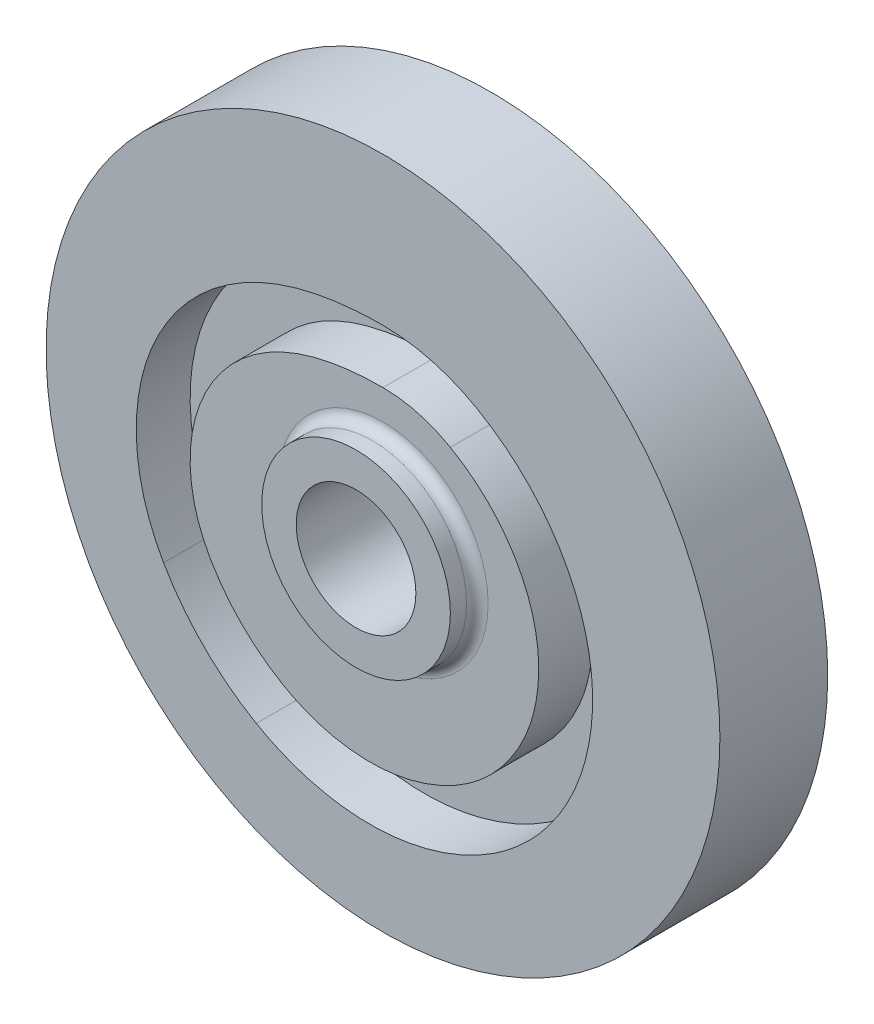
ISO-10303-21;
HEADER;
FILE_DESCRIPTION(('STEP AP214'),'2;1');
FILE_NAME('part.step','',(''),(''),'','','');
FILE_SCHEMA(('AUTOMOTIVE_DESIGN { 1 0 10303 214 1 1 1 1 }'));
ENDSEC;
DATA;
#1=APPLICATION_CONTEXT('core data for automotive mechanical design processes');
#2=APPLICATION_PROTOCOL_DEFINITION('international standard','automotive_design',2000,#1);
#3=PRODUCT_CONTEXT('',#1,'mechanical');
#4=PRODUCT('Part','Part','',(#3));
#5=PRODUCT_RELATED_PRODUCT_CATEGORY('part','',(#4));
#6=PRODUCT_DEFINITION_FORMATION('','',#4);
#7=PRODUCT_DEFINITION_CONTEXT('part definition',#1,'design');
#8=PRODUCT_DEFINITION('design','',#6,#7);
#9=PRODUCT_DEFINITION_SHAPE('','',#8);
#10=(LENGTH_UNIT() NAMED_UNIT(*) SI_UNIT(.MILLI.,.METRE.));
#11=(NAMED_UNIT(*) PLANE_ANGLE_UNIT() SI_UNIT($,.RADIAN.));
#12=(NAMED_UNIT(*) SI_UNIT($,.STERADIAN.) SOLID_ANGLE_UNIT());
#13=UNCERTAINTY_MEASURE_WITH_UNIT(LENGTH_MEASURE(1.E-05),#10,'distance_accuracy_value','');
#14=(GEOMETRIC_REPRESENTATION_CONTEXT(3) GLOBAL_UNCERTAINTY_ASSIGNED_CONTEXT((#13)) GLOBAL_UNIT_ASSIGNED_CONTEXT((#10,
#11,#12)) REPRESENTATION_CONTEXT('',''));
#15=CARTESIAN_POINT('',(0.,0.,0.));
#16=DIRECTION('',(0.,0.,1.));
#17=DIRECTION('',(1.,0.,0.));
#18=AXIS2_PLACEMENT_3D('',#15,#16,#17);
#19=CARTESIAN_POINT('',(0.,-137.641421356237,20.));
#20=DIRECTION('',(0.,0.,1.));
#21=DIRECTION('',(1.,0.,0.));
#22=AXIS2_PLACEMENT_3D('',#19,#20,#21);
#23=PLANE('',#22);
#24=CARTESIAN_POINT('',(0.,0.,20.));
#25=DIRECTION('',(0.,0.,1.));
#26=DIRECTION('',(1.,0.,0.));
#27=AXIS2_PLACEMENT_3D('',#24,#25,#26);
#28=CIRCLE('',#27,62.5);
#29=CARTESIAN_POINT('',(62.5,0.,20.));
#30=VERTEX_POINT('',#29);
#31=EDGE_CURVE('E176',#30,#30,#28,.T.);
#32=ORIENTED_EDGE('',*,*,#31,.T.);
#33=EDGE_LOOP('',(#32));
#34=FACE_BOUND('',#33,.T.);
#35=CARTESIAN_POINT('',(0.,0.,20.));
#36=DIRECTION('',(0.,0.,1.));
#37=DIRECTION('',(1.,0.,0.));
#38=AXIS2_PLACEMENT_3D('',#35,#36,#37);
#39=CIRCLE('',#38,47.);
#40=CARTESIAN_POINT('',(-40.7031939778687,-23.4999999999999,20.));
#41=VERTEX_POINT('',#40);
#42=CARTESIAN_POINT('',(-23.5000000000001,-40.7031939778686,20.));
#43=VERTEX_POINT('',#42);
#44=EDGE_CURVE('E253',#41,#43,#39,.T.);
#45=ORIENTED_EDGE('',*,*,#44,.F.);
#46=CARTESIAN_POINT('',(-40.7031939778687,-23.4999999999999,20.));
#47=CARTESIAN_POINT('',(-41.6334685377336,-21.8887171973251,20.));
#48=CARTESIAN_POINT('',(-43.261081237922,-18.5156221688604,20.));
#49=CARTESIAN_POINT('',(-45.476023039889,-11.4367358366006,20.));
#50=CARTESIAN_POINT('',(-46.2436917445193,-2.10796851513634,20.));
#51=CARTESIAN_POINT('',(-43.902529686518,8.89750578097264,20.));
#52=CARTESIAN_POINT('',(-38.4635483380285,18.7287409637537,20.));
#53=CARTESIAN_POINT('',(-30.4813637366321,26.5585801273208,20.));
#54=CARTESIAN_POINT('',(-20.7611846193058,31.8417853986932,20.));
#55=CARTESIAN_POINT('',(-12.0984465664999,34.0777292610294,20.));
#56=CARTESIAN_POINT('',(-5.16306320945163,34.8818694367635,20.));
#57=CARTESIAN_POINT('',(-1.7246101036514,35.,20.));
#58=CARTESIAN_POINT('',(0.,35.,20.));
#59=B_SPLINE_CURVE_WITH_KNOTS('',3,(#46,#47,#48,#49,#50,#51,#52,#53,#54,#55,#56,#57,#58),
.UNSPECIFIED.,.F.,.F.,(4,1,1,1,1,1,1,1,1,1,4),(0.,0.0625,0.125,0.25,0.375,0.5,0.625,0.75,0.875,
0.9375,1.),.UNSPECIFIED.);
#60=CARTESIAN_POINT('',(0.,35.,20.));
#61=VERTEX_POINT('',#60);
#62=EDGE_CURVE('E47',#41,#61,#59,.T.);
#63=ORIENTED_EDGE('',*,*,#62,.T.);
#64=CARTESIAN_POINT('',(0.,0.,20.));
#65=DIRECTION('',(0.,0.,1.));
#66=DIRECTION('',(1.,0.,0.));
#67=AXIS2_PLACEMENT_3D('',#64,#65,#66);
#68=CIRCLE('',#67,35.);
#69=CARTESIAN_POINT('',(17.5,30.3108891324553,20.));
#70=VERTEX_POINT('',#69);
#71=EDGE_CURVE('E211',#70,#61,#68,.T.);
#72=ORIENTED_EDGE('',*,*,#71,.F.);
#73=CARTESIAN_POINT('',(17.5,30.3108891324553,20.));
#74=CARTESIAN_POINT('',(19.8230717520997,28.9696630310338,20.));
#75=CARTESIAN_POINT('',(24.2422415992508,25.860788383586,20.));
#76=CARTESIAN_POINT('',(31.7674865380313,18.1593049307756,20.));
#77=CARTESIAN_POINT('',(36.9579364853341,8.44241985817381,20.));
#78=CARTESIAN_POINT('',(39.023468485504,-2.34751043143316,20.));
#79=CARTESIAN_POINT('',(38.872672017683,-10.5601551035796,20.));
#80=CARTESIAN_POINT('',(37.094152941544,-18.593345142246,20.));
#81=CARTESIAN_POINT('',(33.6798153813832,-26.1069507980113,20.));
#82=CARTESIAN_POINT('',(28.8613515569635,-32.7441294214389,20.));
#83=CARTESIAN_POINT('',(20.7772547056511,-40.190094392665,20.));
#84=CARTESIAN_POINT('',(10.741659927478,-44.9035382661179,20.));
#85=CARTESIAN_POINT('',(-0.034110412058589,-46.5845639735566,20.));
#86=CARTESIAN_POINT('',(-8.18513011874363,-46.2416151609811,20.));
#87=CARTESIAN_POINT('',(-14.7976649186366,-44.6613903169365,20.));
#88=CARTESIAN_POINT('',(-19.8640084967852,-42.6478933976114,20.));
#89=CARTESIAN_POINT('',(-22.3127518048334,-41.388652042943,20.));
#90=CARTESIAN_POINT('',(-23.5,-40.7031939778686,20.));
#91=B_SPLINE_CURVE_WITH_KNOTS('',3,(#73,#74,#75,#76,#77,#78,#79,#80,#81,#82,#83,#84,#85,#86,#87,
#88,#89,#90),.UNSPECIFIED.,.F.,.F.,(4,1,1,1,1,1,1,1,1,1,1,1,1,1,1,4),(0.,0.0625,0.125,0.25,
0.3125,0.375,0.4375,0.5,0.5625,0.625,0.75,0.8125,0.875,0.9375,0.96875,1.),.UNSPECIFIED.);
#92=EDGE_CURVE('E251',#70,#43,#91,.T.);
#93=ORIENTED_EDGE('',*,*,#92,.T.);
#94=EDGE_LOOP('',(#45,#63,#72,#93));
#95=FACE_BOUND('',#94,.T.);
#96=ADVANCED_FACE('F32',(#34,#95),#23,.T.);
#97=CARTESIAN_POINT('',(0.,0.,20.));
#98=DIRECTION('',(0.,0.,1.));
#99=DIRECTION('',(1.,0.,0.));
#100=AXIS2_PLACEMENT_3D('',#97,#98,#99);
#101=CIRCLE('',#100,19.5);
#102=CARTESIAN_POINT('',(19.5,0.,20.));
#103=VERTEX_POINT('',#102);
#104=EDGE_CURVE('E11',#103,#103,#101,.F.);
#105=ORIENTED_EDGE('',*,*,#104,.T.);
#106=EDGE_LOOP('',(#105));
#107=FACE_BOUND('',#106,.T.);
#108=CARTESIAN_POINT('',(-32.0429399400243,-18.4999999999999,20.));
#109=CARTESIAN_POINT('',(-32.7281649671322,-17.3131554384313,20.));
#110=CARTESIAN_POINT('',(-33.9271147643805,-14.8284070434259,20.));
#111=CARTESIAN_POINT('',(-35.5580156671567,-9.61524406204795,20.));
#112=CARTESIAN_POINT('',(-36.1196082053352,-2.76657539813786,20.));
#113=CARTESIAN_POINT('',(-34.4003220611957,5.3486246331334,20.));
#114=CARTESIAN_POINT('',(-30.3881378010402,12.5918208161777,20.));
#115=CARTESIAN_POINT('',(-25.4695178555637,17.4230052658745,20.));
#116=CARTESIAN_POINT('',(-20.7941116056334,20.416968224699,20.));
#117=CARTESIAN_POINT('',(-15.7676717888697,22.7680180136662,20.));
#118=CARTESIAN_POINT('',(-10.2067997274994,24.2256606889948,20.));
#119=CARTESIAN_POINT('',(-4.44225215696656,24.8972818730671,20.));
#120=CARTESIAN_POINT('',(-1.47461378529173,25.,20.));
#121=CARTESIAN_POINT('',(0.,25.,20.));
#122=B_SPLINE_CURVE_WITH_KNOTS('',3,(#108,#109,#110,#111,#112,#113,#114,#115,#116,#117,#118,
#119,#120,#121),.UNSPECIFIED.,.F.,.F.,(4,1,1,1,1,1,1,1,1,1,1,4),(0.,0.0625,0.125,0.25,0.375,0.5,
0.625,0.6875,0.75,0.875,0.9375,1.),.UNSPECIFIED.);
#123=CARTESIAN_POINT('',(-32.0429399400243,-18.4999999999999,20.));
#124=VERTEX_POINT('',#123);
#125=CARTESIAN_POINT('',(0.,25.,20.));
#126=VERTEX_POINT('',#125);
#127=EDGE_CURVE('E203',#124,#126,#122,.T.);
#128=ORIENTED_EDGE('',*,*,#127,.F.);
#129=CARTESIAN_POINT('',(0.,0.,20.));
#130=DIRECTION('',(0.,0.,1.));
#131=DIRECTION('',(1.,0.,0.));
#132=AXIS2_PLACEMENT_3D('',#129,#130,#131);
#133=CIRCLE('',#132,37.);
#134=CARTESIAN_POINT('',(-18.5,-32.0429399400242,20.));
#135=VERTEX_POINT('',#134);
#136=EDGE_CURVE('E55',#124,#135,#133,.T.);
#137=ORIENTED_EDGE('',*,*,#136,.T.);
#138=CARTESIAN_POINT('',(12.5,21.6506350946109,20.));
#139=CARTESIAN_POINT('',(14.3000505103376,20.6113754479126,20.));
#140=CARTESIAN_POINT('',(17.7365460360028,18.1922821101831,20.));
#141=CARTESIAN_POINT('',(22.0573597497303,13.7662514392354,20.));
#142=CARTESIAN_POINT('',(25.469897132591,8.58906907609287,20.));
#143=CARTESIAN_POINT('',(27.8348958032989,2.83718394254132,20.));
#144=CARTESIAN_POINT('',(28.9862336190251,-3.18490434412384,20.));
#145=CARTESIAN_POINT('',(28.8760558731626,-9.37788778346869,20.));
#146=CARTESIAN_POINT('',(27.5357423087247,-15.4159216475564,20.));
#147=CARTESIAN_POINT('',(24.9902354469051,-21.0217686716921,20.));
#148=CARTESIAN_POINT('',(21.332338770824,-26.0626304877978,20.));
#149=CARTESIAN_POINT('',(16.7758197266253,-30.2594309287163,20.));
#150=CARTESIAN_POINT('',(11.4508193011023,-33.4507053078713,20.));
#151=CARTESIAN_POINT('',(5.55023306841124,-35.5776606117184,20.));
#152=CARTESIAN_POINT('',(-0.603962423950596,-36.5366479897178,20.));
#153=CARTESIAN_POINT('',(-6.79210587388754,-36.274910535155,20.));
#154=CARTESIAN_POINT('',(-12.8485401761874,-34.833293241595,20.));
#155=CARTESIAN_POINT('',(-16.6921895329683,-33.0866797998088,20.));
#156=CARTESIAN_POINT('',(-18.5,-32.0429399400242,20.));
#157=B_SPLINE_CURVE_WITH_KNOTS('',3,(#138,#139,#140,#141,#142,#143,#144,#145,#146,#147,#148,
#149,#150,#151,#152,#153,#154,#155,#156),.UNSPECIFIED.,.F.,.F.,(4,1,1,1,1,1,1,1,1,1,1,1,1,1,1,1,
4),(0.,0.0625,0.125,0.1875,0.25,0.3125,0.375,0.4375,0.5,0.5625,0.625,0.6875,0.75,0.8125,0.875,
0.9375,1.),.UNSPECIFIED.);
#158=CARTESIAN_POINT('',(12.5,21.6506350946109,20.));
#159=VERTEX_POINT('',#158);
#160=EDGE_CURVE('E115',#159,#135,#157,.T.);
#161=ORIENTED_EDGE('',*,*,#160,.F.);
#162=CARTESIAN_POINT('',(0.,0.,20.));
#163=DIRECTION('',(0.,0.,1.));
#164=DIRECTION('',(1.,0.,0.));
#165=AXIS2_PLACEMENT_3D('',#162,#163,#164);
#166=CIRCLE('',#165,25.);
#167=EDGE_CURVE('E206',#159,#126,#166,.T.);
#168=ORIENTED_EDGE('',*,*,#167,.T.);
#169=EDGE_LOOP('',(#128,#137,#161,#168));
#170=FACE_BOUND('',#169,.T.);
#171=ADVANCED_FACE('F162',(#107,#170),#23,.T.);
#172=CARTESIAN_POINT('',(0.,0.,20.));
#173=DIRECTION('',(0.,0.,-1.));
#174=DIRECTION('',(-1.,0.,0.));
#175=AXIS2_PLACEMENT_3D('',#172,#173,#174);
#176=CYLINDRICAL_SURFACE('',#175,62.5);
#177=ORIENTED_EDGE('',*,*,#31,.F.);
#178=EDGE_LOOP('',(#177));
#179=FACE_BOUND('',#178,.T.);
#180=CARTESIAN_POINT('',(0.,0.,0.));
#181=DIRECTION('',(0.,0.,1.));
#182=DIRECTION('',(1.,0.,0.));
#183=AXIS2_PLACEMENT_3D('',#180,#181,#182);
#184=CIRCLE('',#183,62.5);
#185=CARTESIAN_POINT('',(62.5,0.,0.));
#186=VERTEX_POINT('',#185);
#187=EDGE_CURVE('E179',#186,#186,#184,.T.);
#188=ORIENTED_EDGE('',*,*,#187,.T.);
#189=EDGE_LOOP('',(#188));
#190=FACE_BOUND('',#189,.T.);
#191=ADVANCED_FACE('F165',(#179,#190),#176,.T.);
#192=CARTESIAN_POINT('',(0.,-137.641421356237,0.));
#193=DIRECTION('',(0.,0.,1.));
#194=DIRECTION('',(1.,0.,0.));
#195=AXIS2_PLACEMENT_3D('',#192,#193,#194);
#196=PLANE('',#195);
#197=ORIENTED_EDGE('',*,*,#187,.F.);
#198=EDGE_LOOP('',(#197));
#199=FACE_BOUND('',#198,.T.);
#200=CARTESIAN_POINT('',(0.,0.,0.));
#201=DIRECTION('',(0.,0.,1.));
#202=DIRECTION('',(1.,0.,0.));
#203=AXIS2_PLACEMENT_3D('',#200,#201,#202);
#204=CIRCLE('',#203,11.1);
#205=CARTESIAN_POINT('',(11.1,0.,0.));
#206=VERTEX_POINT('',#205);
#207=EDGE_CURVE('E229',#206,#206,#204,.T.);
#208=ORIENTED_EDGE('',*,*,#207,.T.);
#209=EDGE_LOOP('',(#208));
#210=FACE_BOUND('',#209,.T.);
#211=ADVANCED_FACE('F158',(#199,#210),#196,.F.);
#212=CARTESIAN_POINT('',(0.,0.,25.));
#213=DIRECTION('',(0.,0.,-1.));
#214=DIRECTION('',(-1.,0.,0.));
#215=AXIS2_PLACEMENT_3D('',#212,#213,#214);
#216=CYLINDRICAL_SURFACE('',#215,11.1);
#217=CARTESIAN_POINT('',(0.,0.,25.));
#218=DIRECTION('',(0.,0.,1.));
#219=DIRECTION('',(1.,0.,0.));
#220=AXIS2_PLACEMENT_3D('',#217,#218,#219);
#221=CIRCLE('',#220,11.1);
#222=CARTESIAN_POINT('',(11.1,0.,25.));
#223=VERTEX_POINT('',#222);
#224=EDGE_CURVE('E184',#223,#223,#221,.T.);
#225=ORIENTED_EDGE('',*,*,#224,.T.);
#226=EDGE_LOOP('',(#225));
#227=FACE_BOUND('',#226,.T.);
#228=ORIENTED_EDGE('',*,*,#207,.F.);
#229=EDGE_LOOP('',(#228));
#230=FACE_BOUND('',#229,.T.);
#231=ADVANCED_FACE('F154',(#227,#230),#216,.F.);
#232=CARTESIAN_POINT('',(0.,0.,25.));
#233=DIRECTION('',(0.,0.,-1.));
#234=DIRECTION('',(-1.,0.,0.));
#235=AXIS2_PLACEMENT_3D('',#232,#233,#234);
#236=CYLINDRICAL_SURFACE('',#235,17.5);
#237=CARTESIAN_POINT('',(0.,0.,22.));
#238=DIRECTION('',(0.,0.,1.));
#239=DIRECTION('',(1.,0.,0.));
#240=AXIS2_PLACEMENT_3D('',#237,#238,#239);
#241=CIRCLE('',#240,17.5);
#242=CARTESIAN_POINT('',(17.5,0.,22.));
#243=VERTEX_POINT('',#242);
#244=EDGE_CURVE('E40',#243,#243,#241,.T.);
#245=ORIENTED_EDGE('',*,*,#244,.T.);
#246=EDGE_LOOP('',(#245));
#247=FACE_BOUND('',#246,.T.);
#248=CARTESIAN_POINT('',(0.,0.,25.));
#249=DIRECTION('',(0.,0.,1.));
#250=DIRECTION('',(1.,0.,0.));
#251=AXIS2_PLACEMENT_3D('',#248,#249,#250);
#252=CIRCLE('',#251,17.5);
#253=CARTESIAN_POINT('',(17.5,0.,25.));
#254=VERTEX_POINT('',#253);
#255=EDGE_CURVE('E180',#254,#254,#252,.T.);
#256=ORIENTED_EDGE('',*,*,#255,.F.);
#257=EDGE_LOOP('',(#256));
#258=FACE_BOUND('',#257,.T.);
#259=ADVANCED_FACE('F150',(#247,#258),#236,.T.);
#260=CARTESIAN_POINT('',(0.,-137.641421356237,25.));
#261=DIRECTION('',(0.,0.,1.));
#262=DIRECTION('',(1.,0.,0.));
#263=AXIS2_PLACEMENT_3D('',#260,#261,#262);
#264=PLANE('',#263);
#265=ORIENTED_EDGE('',*,*,#224,.F.);
#266=EDGE_LOOP('',(#265));
#267=FACE_BOUND('',#266,.T.);
#268=ORIENTED_EDGE('',*,*,#255,.T.);
#269=EDGE_LOOP('',(#268));
#270=FACE_BOUND('',#269,.T.);
#271=ADVANCED_FACE('F147',(#267,#270),#264,.T.);
#272=CARTESIAN_POINT('',(0.,0.,22.));
#273=DIRECTION('',(0.,0.,1.));
#274=DIRECTION('',(1.,0.,0.));
#275=AXIS2_PLACEMENT_3D('',#272,#273,#274);
#276=TOROIDAL_SURFACE('',#275,19.5,2.);
#277=ORIENTED_EDGE('',*,*,#104,.F.);
#278=EDGE_LOOP('',(#277));
#279=FACE_BOUND('',#278,.T.);
#280=ORIENTED_EDGE('',*,*,#244,.F.);
#281=EDGE_LOOP('',(#280));
#282=FACE_BOUND('',#281,.T.);
#283=ADVANCED_FACE('F34',(#279,#282),#276,.F.);
#284=CARTESIAN_POINT('',(0.,0.,10.));
#285=DIRECTION('',(0.,0.,1.));
#286=DIRECTION('',(1.,0.,0.));
#287=AXIS2_PLACEMENT_3D('',#284,#285,#286);
#288=CYLINDRICAL_SURFACE('',#287,37.);
#289=ORIENTED_EDGE('',*,*,#136,.F.);
#290=DIRECTION('',(0.,0.,1.));
#291=VECTOR('',#290,1.);
#292=CARTESIAN_POINT('',(-32.0429399400243,-18.4999999999999,10.));
#293=LINE('',#292,#291);
#294=CARTESIAN_POINT('',(-32.0429399400243,-18.4999999999999,10.));
#295=VERTEX_POINT('',#294);
#296=EDGE_CURVE('E234',#295,#124,#293,.T.);
#297=ORIENTED_EDGE('',*,*,#296,.F.);
#298=CARTESIAN_POINT('',(0.,0.,10.));
#299=DIRECTION('',(0.,0.,1.));
#300=DIRECTION('',(1.,0.,0.));
#301=AXIS2_PLACEMENT_3D('',#298,#299,#300);
#302=CIRCLE('',#301,37.);
#303=CARTESIAN_POINT('',(-18.5,-32.0429399400242,10.));
#304=VERTEX_POINT('',#303);
#305=EDGE_CURVE('E294',#295,#304,#302,.T.);
#306=ORIENTED_EDGE('',*,*,#305,.T.);
#307=DIRECTION('',(0.,0.,1.));
#308=VECTOR('',#307,1.);
#309=CARTESIAN_POINT('',(-18.5,-32.0429399400242,10.));
#310=LINE('',#309,#308);
#311=EDGE_CURVE('E224',#304,#135,#310,.T.);
#312=ORIENTED_EDGE('',*,*,#311,.T.);
#313=EDGE_LOOP('',(#289,#297,#306,#312));
#314=FACE_BOUND('',#313,.T.);
#315=ADVANCED_FACE('F192',(#314),#288,.T.);
#316=CARTESIAN_POINT('',(12.5,21.6506350946109,10.));
#317=CARTESIAN_POINT('',(14.3000505103376,20.6113754479126,10.));
#318=CARTESIAN_POINT('',(17.7365460360028,18.1922821101831,10.));
#319=CARTESIAN_POINT('',(22.0573597497303,13.7662514392354,10.));
#320=CARTESIAN_POINT('',(25.469897132591,8.58906907609287,10.));
#321=CARTESIAN_POINT('',(27.8348958032989,2.83718394254132,10.));
#322=CARTESIAN_POINT('',(28.9862336190251,-3.18490434412384,10.));
#323=CARTESIAN_POINT('',(28.8760558731626,-9.37788778346869,10.));
#324=CARTESIAN_POINT('',(27.5357423087247,-15.4159216475564,10.));
#325=CARTESIAN_POINT('',(24.9902354469051,-21.0217686716921,10.));
#326=CARTESIAN_POINT('',(21.332338770824,-26.0626304877978,10.));
#327=CARTESIAN_POINT('',(16.7758197266253,-30.2594309287163,10.));
#328=CARTESIAN_POINT('',(11.4508193011023,-33.4507053078713,10.));
#329=CARTESIAN_POINT('',(5.55023306841124,-35.5776606117184,10.));
#330=CARTESIAN_POINT('',(-0.603962423950596,-36.5366479897178,10.));
#331=CARTESIAN_POINT('',(-6.79210587388754,-36.274910535155,10.));
#332=CARTESIAN_POINT('',(-12.8485401761874,-34.833293241595,10.));
#333=CARTESIAN_POINT('',(-16.6921895329683,-33.0866797998088,10.));
#334=CARTESIAN_POINT('',(-18.5,-32.0429399400242,10.));
#335=B_SPLINE_CURVE_WITH_KNOTS('',3,(#316,#317,#318,#319,#320,#321,#322,#323,#324,#325,#326,
#327,#328,#329,#330,#331,#332,#333,#334),.UNSPECIFIED.,.F.,.F.,(4,1,1,1,1,1,1,1,1,1,1,1,1,1,1,1,
4),(0.,0.0625,0.125,0.1875,0.25,0.3125,0.375,0.4375,0.5,0.5625,0.625,0.6875,0.75,0.8125,0.875,
0.9375,1.),.UNSPECIFIED.);
#336=DIRECTION('',(0.,0.,1.));
#337=VECTOR('',#336,1.);
#338=SURFACE_OF_LINEAR_EXTRUSION('',#335,#337);
#339=ORIENTED_EDGE('',*,*,#160,.T.);
#340=ORIENTED_EDGE('',*,*,#311,.F.);
#341=CARTESIAN_POINT('',(12.5,21.6506350946109,10.));
#342=VERTEX_POINT('',#341);
#343=EDGE_CURVE('E104',#342,#304,#335,.T.);
#344=ORIENTED_EDGE('',*,*,#343,.F.);
#345=DIRECTION('',(0.,0.,1.));
#346=VECTOR('',#345,1.);
#347=CARTESIAN_POINT('',(12.5,21.6506350946109,10.));
#348=LINE('',#347,#346);
#349=EDGE_CURVE('E230',#342,#159,#348,.T.);
#350=ORIENTED_EDGE('',*,*,#349,.T.);
#351=EDGE_LOOP('',(#339,#340,#344,#350));
#352=FACE_BOUND('',#351,.T.);
#353=ADVANCED_FACE('F197',(#352),#338,.F.);
#354=CARTESIAN_POINT('',(0.,0.,10.));
#355=DIRECTION('',(0.,0.,1.));
#356=DIRECTION('',(1.,0.,0.));
#357=AXIS2_PLACEMENT_3D('',#354,#355,#356);
#358=CYLINDRICAL_SURFACE('',#357,25.);
#359=ORIENTED_EDGE('',*,*,#167,.F.);
#360=ORIENTED_EDGE('',*,*,#349,.F.);
#361=CARTESIAN_POINT('',(0.,0.,10.));
#362=DIRECTION('',(0.,0.,1.));
#363=DIRECTION('',(1.,0.,0.));
#364=AXIS2_PLACEMENT_3D('',#361,#362,#363);
#365=CIRCLE('',#364,25.);
#366=CARTESIAN_POINT('',(0.,25.,10.));
#367=VERTEX_POINT('',#366);
#368=EDGE_CURVE('E275',#342,#367,#365,.T.);
#369=ORIENTED_EDGE('',*,*,#368,.T.);
#370=DIRECTION('',(0.,0.,1.));
#371=VECTOR('',#370,1.);
#372=CARTESIAN_POINT('',(0.,25.,10.));
#373=LINE('',#372,#371);
#374=EDGE_CURVE('E232',#367,#126,#373,.T.);
#375=ORIENTED_EDGE('',*,*,#374,.T.);
#376=EDGE_LOOP('',(#359,#360,#369,#375));
#377=FACE_BOUND('',#376,.T.);
#378=ADVANCED_FACE('F146',(#377),#358,.T.);
#379=CARTESIAN_POINT('',(-40.7031939778687,-23.4999999999999,10.));
#380=CARTESIAN_POINT('',(-41.6334685377336,-21.8887171973251,10.));
#381=CARTESIAN_POINT('',(-43.261081237922,-18.5156221688604,10.));
#382=CARTESIAN_POINT('',(-45.476023039889,-11.4367358366006,10.));
#383=CARTESIAN_POINT('',(-46.2436917445193,-2.10796851513634,10.));
#384=CARTESIAN_POINT('',(-43.902529686518,8.89750578097264,10.));
#385=CARTESIAN_POINT('',(-38.4635483380285,18.7287409637537,10.));
#386=CARTESIAN_POINT('',(-30.4813637366321,26.5585801273208,10.));
#387=CARTESIAN_POINT('',(-20.7611846193058,31.8417853986932,10.));
#388=CARTESIAN_POINT('',(-12.0984465664999,34.0777292610294,10.));
#389=CARTESIAN_POINT('',(-5.16306320945163,34.8818694367635,10.));
#390=CARTESIAN_POINT('',(-1.7246101036514,35.,10.));
#391=CARTESIAN_POINT('',(0.,35.,10.));
#392=B_SPLINE_CURVE_WITH_KNOTS('',3,(#379,#380,#381,#382,#383,#384,#385,#386,#387,#388,#389,
#390,#391),.UNSPECIFIED.,.F.,.F.,(4,1,1,1,1,1,1,1,1,1,4),(0.,0.0625,0.125,0.25,0.375,0.5,0.625,
0.75,0.875,0.9375,1.),.UNSPECIFIED.);
#393=DIRECTION('',(0.,0.,1.));
#394=VECTOR('',#393,1.);
#395=SURFACE_OF_LINEAR_EXTRUSION('',#392,#394);
#396=ORIENTED_EDGE('',*,*,#62,.F.);
#397=DIRECTION('',(0.,0.,1.));
#398=VECTOR('',#397,1.);
#399=CARTESIAN_POINT('',(-40.7031939778687,-23.4999999999999,10.));
#400=LINE('',#399,#398);
#401=CARTESIAN_POINT('',(-40.7031939778687,-23.4999999999999,10.));
#402=VERTEX_POINT('',#401);
#403=EDGE_CURVE('E94',#402,#41,#400,.T.);
#404=ORIENTED_EDGE('',*,*,#403,.F.);
#405=CARTESIAN_POINT('',(0.,35.,10.));
#406=VERTEX_POINT('',#405);
#407=EDGE_CURVE('E97',#402,#406,#392,.T.);
#408=ORIENTED_EDGE('',*,*,#407,.T.);
#409=DIRECTION('',(0.,0.,1.));
#410=VECTOR('',#409,1.);
#411=CARTESIAN_POINT('',(0.,35.,10.));
#412=LINE('',#411,#410);
#413=EDGE_CURVE('E236',#406,#61,#412,.T.);
#414=ORIENTED_EDGE('',*,*,#413,.T.);
#415=EDGE_LOOP('',(#396,#404,#408,#414));
#416=FACE_BOUND('',#415,.T.);
#417=ADVANCED_FACE('F96',(#416),#395,.T.);
#418=CARTESIAN_POINT('',(0.,0.,10.));
#419=DIRECTION('',(0.,0.,1.));
#420=DIRECTION('',(1.,0.,0.));
#421=AXIS2_PLACEMENT_3D('',#418,#419,#420);
#422=CYLINDRICAL_SURFACE('',#421,35.);
#423=ORIENTED_EDGE('',*,*,#71,.T.);
#424=ORIENTED_EDGE('',*,*,#413,.F.);
#425=CARTESIAN_POINT('',(0.,0.,10.));
#426=DIRECTION('',(0.,0.,1.));
#427=DIRECTION('',(1.,0.,0.));
#428=AXIS2_PLACEMENT_3D('',#425,#426,#427);
#429=CIRCLE('',#428,35.);
#430=CARTESIAN_POINT('',(17.5,30.3108891324553,10.));
#431=VERTEX_POINT('',#430);
#432=EDGE_CURVE('E114',#431,#406,#429,.T.);
#433=ORIENTED_EDGE('',*,*,#432,.F.);
#434=DIRECTION('',(0.,0.,1.));
#435=VECTOR('',#434,1.);
#436=CARTESIAN_POINT('',(17.5,30.3108891324553,10.));
#437=LINE('',#436,#435);
#438=EDGE_CURVE('E238',#431,#70,#437,.T.);
#439=ORIENTED_EDGE('',*,*,#438,.T.);
#440=EDGE_LOOP('',(#423,#424,#433,#439));
#441=FACE_BOUND('',#440,.T.);
#442=ADVANCED_FACE('F138',(#441),#422,.F.);
#443=CARTESIAN_POINT('',(17.5,30.3108891324553,10.));
#444=CARTESIAN_POINT('',(19.8230717520997,28.9696630310338,10.));
#445=CARTESIAN_POINT('',(24.2422415992508,25.860788383586,10.));
#446=CARTESIAN_POINT('',(31.7674865380313,18.1593049307756,10.));
#447=CARTESIAN_POINT('',(36.9579364853341,8.44241985817381,10.));
#448=CARTESIAN_POINT('',(39.023468485504,-2.34751043143316,10.));
#449=CARTESIAN_POINT('',(38.872672017683,-10.5601551035796,10.));
#450=CARTESIAN_POINT('',(37.094152941544,-18.593345142246,10.));
#451=CARTESIAN_POINT('',(33.6798153813832,-26.1069507980113,10.));
#452=CARTESIAN_POINT('',(28.8613515569635,-32.7441294214389,10.));
#453=CARTESIAN_POINT('',(20.7772547056511,-40.190094392665,10.));
#454=CARTESIAN_POINT('',(10.741659927478,-44.9035382661179,10.));
#455=CARTESIAN_POINT('',(-0.034110412058589,-46.5845639735566,10.));
#456=CARTESIAN_POINT('',(-8.18513011874363,-46.2416151609811,10.));
#457=CARTESIAN_POINT('',(-14.7976649186366,-44.6613903169365,10.));
#458=CARTESIAN_POINT('',(-19.8640084967852,-42.6478933976114,10.));
#459=CARTESIAN_POINT('',(-22.3127518048334,-41.388652042943,10.));
#460=CARTESIAN_POINT('',(-23.5,-40.7031939778686,10.));
#461=B_SPLINE_CURVE_WITH_KNOTS('',3,(#443,#444,#445,#446,#447,#448,#449,#450,#451,#452,#453,
#454,#455,#456,#457,#458,#459,#460),.UNSPECIFIED.,.F.,.F.,(4,1,1,1,1,1,1,1,1,1,1,1,1,1,1,4),(0.,
0.0625,0.125,0.25,0.3125,0.375,0.4375,0.5,0.5625,0.625,0.75,0.8125,0.875,0.9375,0.96875,1.),.UNSPECIFIED.);
#462=DIRECTION('',(0.,0.,1.));
#463=VECTOR('',#462,1.);
#464=SURFACE_OF_LINEAR_EXTRUSION('',#461,#463);
#465=ORIENTED_EDGE('',*,*,#92,.F.);
#466=ORIENTED_EDGE('',*,*,#438,.F.);
#467=CARTESIAN_POINT('',(-23.5000000000001,-40.7031939778686,10.));
#468=VERTEX_POINT('',#467);
#469=EDGE_CURVE('E119',#431,#468,#461,.T.);
#470=ORIENTED_EDGE('',*,*,#469,.T.);
#471=DIRECTION('',(0.,0.,1.));
#472=VECTOR('',#471,1.);
#473=CARTESIAN_POINT('',(-23.5000000000001,-40.7031939778686,10.));
#474=LINE('',#473,#472);
#475=EDGE_CURVE('E103',#468,#43,#474,.T.);
#476=ORIENTED_EDGE('',*,*,#475,.T.);
#477=EDGE_LOOP('',(#465,#466,#470,#476));
#478=FACE_BOUND('',#477,.T.);
#479=ADVANCED_FACE('F134',(#478),#464,.T.);
#480=CARTESIAN_POINT('',(0.,0.,10.));
#481=DIRECTION('',(0.,0.,1.));
#482=DIRECTION('',(1.,0.,0.));
#483=AXIS2_PLACEMENT_3D('',#480,#481,#482);
#484=CYLINDRICAL_SURFACE('',#483,47.);
#485=ORIENTED_EDGE('',*,*,#44,.T.);
#486=ORIENTED_EDGE('',*,*,#475,.F.);
#487=CARTESIAN_POINT('',(0.,0.,10.));
#488=DIRECTION('',(0.,0.,1.));
#489=DIRECTION('',(1.,0.,0.));
#490=AXIS2_PLACEMENT_3D('',#487,#488,#489);
#491=CIRCLE('',#490,47.);
#492=EDGE_CURVE('E112',#402,#468,#491,.T.);
#493=ORIENTED_EDGE('',*,*,#492,.F.);
#494=ORIENTED_EDGE('',*,*,#403,.T.);
#495=EDGE_LOOP('',(#485,#486,#493,#494));
#496=FACE_BOUND('',#495,.T.);
#497=ADVANCED_FACE('F118',(#496),#484,.F.);
#498=CARTESIAN_POINT('',(-32.0429399400243,-18.4999999999999,10.));
#499=CARTESIAN_POINT('',(-32.7281649671322,-17.3131554384313,10.));
#500=CARTESIAN_POINT('',(-33.9271147643805,-14.8284070434259,10.));
#501=CARTESIAN_POINT('',(-35.5580156671567,-9.61524406204795,10.));
#502=CARTESIAN_POINT('',(-36.1196082053352,-2.76657539813786,10.));
#503=CARTESIAN_POINT('',(-34.4003220611957,5.3486246331334,10.));
#504=CARTESIAN_POINT('',(-30.3881378010402,12.5918208161777,10.));
#505=CARTESIAN_POINT('',(-25.4695178555637,17.4230052658745,10.));
#506=CARTESIAN_POINT('',(-20.7941116056334,20.416968224699,10.));
#507=CARTESIAN_POINT('',(-15.7676717888697,22.7680180136662,10.));
#508=CARTESIAN_POINT('',(-10.2067997274994,24.2256606889948,10.));
#509=CARTESIAN_POINT('',(-4.44225215696656,24.8972818730671,10.));
#510=CARTESIAN_POINT('',(-1.47461378529173,25.,10.));
#511=CARTESIAN_POINT('',(0.,25.,10.));
#512=B_SPLINE_CURVE_WITH_KNOTS('',3,(#498,#499,#500,#501,#502,#503,#504,#505,#506,#507,#508,
#509,#510,#511),.UNSPECIFIED.,.F.,.F.,(4,1,1,1,1,1,1,1,1,1,1,4),(0.,0.0625,0.125,0.25,0.375,0.5,
0.625,0.6875,0.75,0.875,0.9375,1.),.UNSPECIFIED.);
#513=DIRECTION('',(0.,0.,1.));
#514=VECTOR('',#513,1.);
#515=SURFACE_OF_LINEAR_EXTRUSION('',#512,#514);
#516=ORIENTED_EDGE('',*,*,#127,.T.);
#517=ORIENTED_EDGE('',*,*,#374,.F.);
#518=EDGE_CURVE('E289',#295,#367,#512,.T.);
#519=ORIENTED_EDGE('',*,*,#518,.F.);
#520=ORIENTED_EDGE('',*,*,#296,.T.);
#521=EDGE_LOOP('',(#516,#517,#519,#520));
#522=FACE_BOUND('',#521,.T.);
#523=ADVANCED_FACE('F143',(#522),#515,.F.);
#524=CARTESIAN_POINT('',(0.,-137.641421356237,10.));
#525=DIRECTION('',(0.,0.,1.));
#526=DIRECTION('',(1.,0.,0.));
#527=AXIS2_PLACEMENT_3D('',#524,#525,#526);
#528=PLANE('',#527);
#529=ORIENTED_EDGE('',*,*,#407,.F.);
#530=ORIENTED_EDGE('',*,*,#492,.T.);
#531=ORIENTED_EDGE('',*,*,#469,.F.);
#532=ORIENTED_EDGE('',*,*,#432,.T.);
#533=EDGE_LOOP('',(#529,#530,#531,#532));
#534=FACE_BOUND('',#533,.T.);
#535=ORIENTED_EDGE('',*,*,#305,.F.);
#536=ORIENTED_EDGE('',*,*,#518,.T.);
#537=ORIENTED_EDGE('',*,*,#368,.F.);
#538=ORIENTED_EDGE('',*,*,#343,.T.);
#539=EDGE_LOOP('',(#535,#536,#537,#538));
#540=FACE_BOUND('',#539,.T.);
#541=ADVANCED_FACE('F109',(#534,#540),#528,.T.);
#542=CLOSED_SHELL('',(#96,#171,#191,#211,#231,#259,#271,#283,#315,#353,#378,#417,#442,#479,#497,
#523,#541));
#543=MANIFOLD_SOLID_BREP('B2',#542);
#544=ADVANCED_BREP_SHAPE_REPRESENTATION('',(#18,#543),#14);
#545=SHAPE_DEFINITION_REPRESENTATION(#9,#544);
ENDSEC;
END-ISO-10303-21;
